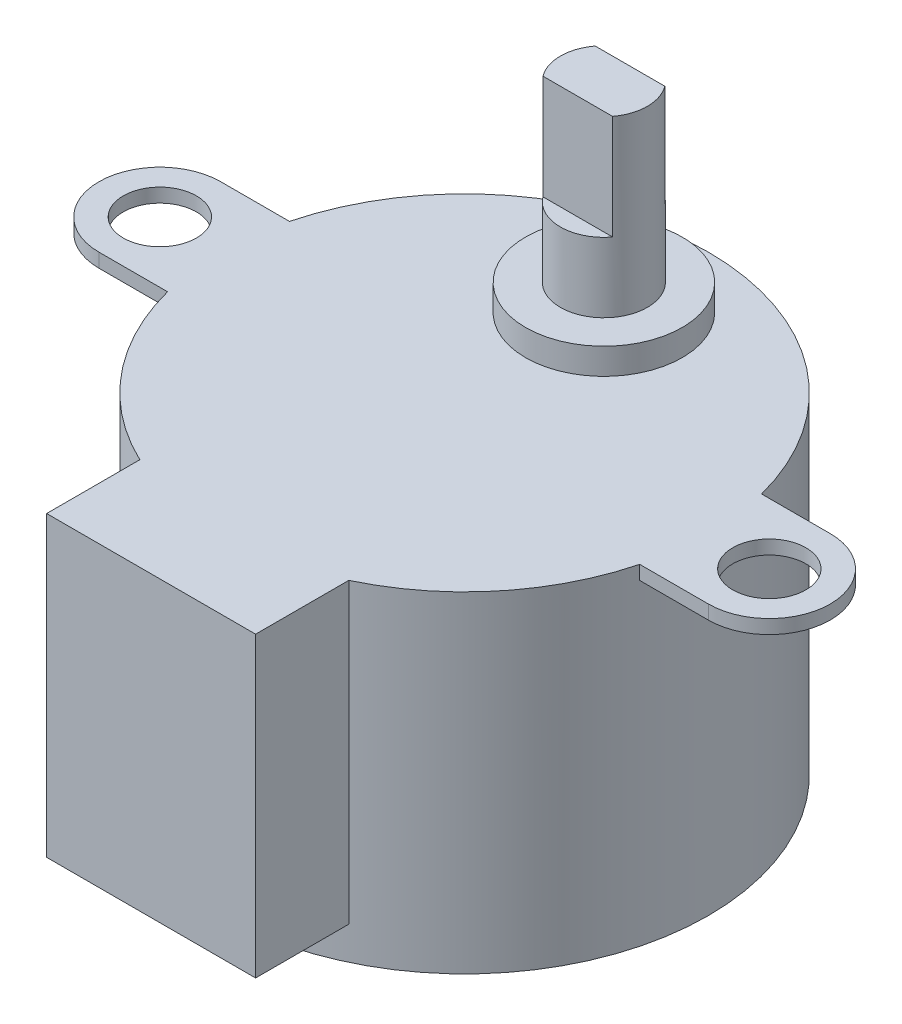
ISO-10303-21;
HEADER;
FILE_DESCRIPTION(('STEP AP214'),'2;1');
FILE_NAME('part.step','',(''),(''),'','','');
FILE_SCHEMA(('AUTOMOTIVE_DESIGN { 1 0 10303 214 1 1 1 1 }'));
ENDSEC;
DATA;
#1=APPLICATION_CONTEXT('core data for automotive mechanical design processes');
#2=APPLICATION_PROTOCOL_DEFINITION('international standard','automotive_design',2000,#1);
#3=PRODUCT_CONTEXT('',#1,'mechanical');
#4=PRODUCT('Part','Part','',(#3));
#5=PRODUCT_RELATED_PRODUCT_CATEGORY('part','',(#4));
#6=PRODUCT_DEFINITION_FORMATION('','',#4);
#7=PRODUCT_DEFINITION_CONTEXT('part definition',#1,'design');
#8=PRODUCT_DEFINITION('design','',#6,#7);
#9=PRODUCT_DEFINITION_SHAPE('','',#8);
#10=(LENGTH_UNIT() NAMED_UNIT(*) SI_UNIT(.MILLI.,.METRE.));
#11=(NAMED_UNIT(*) PLANE_ANGLE_UNIT() SI_UNIT($,.RADIAN.));
#12=(NAMED_UNIT(*) SI_UNIT($,.STERADIAN.) SOLID_ANGLE_UNIT());
#13=UNCERTAINTY_MEASURE_WITH_UNIT(LENGTH_MEASURE(1.E-05),#10,'distance_accuracy_value','');
#14=(GEOMETRIC_REPRESENTATION_CONTEXT(3) GLOBAL_UNCERTAINTY_ASSIGNED_CONTEXT((#13)) GLOBAL_UNIT_ASSIGNED_CONTEXT((#10,
#11,#12)) REPRESENTATION_CONTEXT('',''));
#15=CARTESIAN_POINT('',(0.,0.,0.));
#16=DIRECTION('',(0.,0.,1.));
#17=DIRECTION('',(1.,0.,0.));
#18=AXIS2_PLACEMENT_3D('',#15,#16,#17);
#19=CARTESIAN_POINT('',(0.,19.,0.));
#20=DIRECTION('',(0.,-1.,0.));
#21=DIRECTION('',(0.,0.,-1.));
#22=AXIS2_PLACEMENT_3D('',#19,#20,#21);
#23=CYLINDRICAL_SURFACE('',#22,14.);
#24=CARTESIAN_POINT('',(0.,1.9,0.));
#25=DIRECTION('',(0.,-1.,0.));
#26=DIRECTION('',(0.,0.,-1.));
#27=AXIS2_PLACEMENT_3D('',#24,#25,#26);
#28=CIRCLE('',#27,14.);
#29=CARTESIAN_POINT('',(-6.,1.9,12.6491106406735));
#30=VERTEX_POINT('',#29);
#31=CARTESIAN_POINT('',(6.,1.9,12.6491106406735));
#32=VERTEX_POINT('',#31);
#33=EDGE_CURVE('E199',#30,#32,#28,.F.);
#34=ORIENTED_EDGE('',*,*,#33,.F.);
#35=DIRECTION('',(0.,-1.,0.));
#36=VECTOR('',#35,1.);
#37=CARTESIAN_POINT('',(-6.,19.,12.6491106406735));
#38=LINE('',#37,#36);
#39=CARTESIAN_POINT('',(-6.,19.,12.6491106406735));
#40=VERTEX_POINT('',#39);
#41=EDGE_CURVE('E176',#40,#30,#38,.T.);
#42=ORIENTED_EDGE('',*,*,#41,.F.);
#43=CARTESIAN_POINT('',(0.,19.,0.));
#44=DIRECTION('',(0.,1.,0.));
#45=DIRECTION('',(0.,0.,1.));
#46=AXIS2_PLACEMENT_3D('',#43,#44,#45);
#47=CIRCLE('',#46,14.);
#48=CARTESIAN_POINT('',(-13.555441711726,19.,3.5));
#49=VERTEX_POINT('',#48);
#50=EDGE_CURVE('E272',#49,#40,#47,.T.);
#51=ORIENTED_EDGE('',*,*,#50,.F.);
#52=DIRECTION('',(0.,1.,0.));
#53=VECTOR('',#52,1.);
#54=CARTESIAN_POINT('',(-13.555441711726,18.2,3.5));
#55=LINE('',#54,#53);
#56=CARTESIAN_POINT('',(-13.555441711726,18.2,3.5));
#57=VERTEX_POINT('',#56);
#58=EDGE_CURVE('E268',#57,#49,#55,.T.);
#59=ORIENTED_EDGE('',*,*,#58,.F.);
#60=CARTESIAN_POINT('',(0.,18.2,0.));
#61=DIRECTION('',(0.,1.,0.));
#62=DIRECTION('',(0.,0.,1.));
#63=AXIS2_PLACEMENT_3D('',#60,#61,#62);
#64=CIRCLE('',#63,14.);
#65=CARTESIAN_POINT('',(-13.555441711726,18.2,-3.5));
#66=VERTEX_POINT('',#65);
#67=EDGE_CURVE('E279',#66,#57,#64,.T.);
#68=ORIENTED_EDGE('',*,*,#67,.F.);
#69=DIRECTION('',(0.,1.,0.));
#70=VECTOR('',#69,1.);
#71=CARTESIAN_POINT('',(-13.555441711726,18.2,-3.5));
#72=LINE('',#71,#70);
#73=CARTESIAN_POINT('',(-13.555441711726,19.,-3.5));
#74=VERTEX_POINT('',#73);
#75=EDGE_CURVE('E255',#66,#74,#72,.T.);
#76=ORIENTED_EDGE('',*,*,#75,.T.);
#77=CARTESIAN_POINT('',(13.555441711726,19.,-3.5));
#78=VERTEX_POINT('',#77);
#79=EDGE_CURVE('E275',#78,#74,#47,.T.);
#80=ORIENTED_EDGE('',*,*,#79,.F.);
#81=DIRECTION('',(0.,1.,0.));
#82=VECTOR('',#81,1.);
#83=CARTESIAN_POINT('',(13.555441711726,18.2,-3.5));
#84=LINE('',#83,#82);
#85=CARTESIAN_POINT('',(13.555441711726,18.2,-3.5));
#86=VERTEX_POINT('',#85);
#87=EDGE_CURVE('E258',#86,#78,#84,.T.);
#88=ORIENTED_EDGE('',*,*,#87,.F.);
#89=CARTESIAN_POINT('',(13.555441711726,18.2,3.5));
#90=VERTEX_POINT('',#89);
#91=EDGE_CURVE('E172',#90,#86,#64,.T.);
#92=ORIENTED_EDGE('',*,*,#91,.F.);
#93=DIRECTION('',(0.,1.,0.));
#94=VECTOR('',#93,1.);
#95=CARTESIAN_POINT('',(13.555441711726,18.2,3.5));
#96=LINE('',#95,#94);
#97=CARTESIAN_POINT('',(13.555441711726,19.,3.5));
#98=VERTEX_POINT('',#97);
#99=EDGE_CURVE('E265',#90,#98,#96,.T.);
#100=ORIENTED_EDGE('',*,*,#99,.T.);
#101=CARTESIAN_POINT('',(6.,19.,12.6491106406735));
#102=VERTEX_POINT('',#101);
#103=EDGE_CURVE('E276',#102,#98,#47,.T.);
#104=ORIENTED_EDGE('',*,*,#103,.F.);
#105=DIRECTION('',(0.,-1.,0.));
#106=VECTOR('',#105,1.);
#107=CARTESIAN_POINT('',(6.,19.,12.6491106406735));
#108=LINE('',#107,#106);
#109=EDGE_CURVE('E195',#32,#102,#108,.F.);
#110=ORIENTED_EDGE('',*,*,#109,.F.);
#111=EDGE_LOOP('',(#34,#42,#51,#59,#68,#76,#80,#88,#92,#100,#104,#110));
#112=FACE_BOUND('',#111,.T.);
#113=CARTESIAN_POINT('',(0.,0.,0.));
#114=DIRECTION('',(0.,1.,0.));
#115=DIRECTION('',(0.,0.,1.));
#116=AXIS2_PLACEMENT_3D('',#113,#114,#115);
#117=CIRCLE('',#116,14.);
#118=CARTESIAN_POINT('',(0.,0.,14.));
#119=VERTEX_POINT('',#118);
#120=EDGE_CURVE('E254',#119,#119,#117,.T.);
#121=ORIENTED_EDGE('',*,*,#120,.T.);
#122=EDGE_LOOP('',(#121));
#123=FACE_BOUND('',#122,.T.);
#124=ADVANCED_FACE('F32',(#112,#123),#23,.T.);
#125=CARTESIAN_POINT('',(0.,19.,0.));
#126=DIRECTION('',(0.,1.,0.));
#127=DIRECTION('',(0.,0.,1.));
#128=AXIS2_PLACEMENT_3D('',#125,#126,#127);
#129=PLANE('',#128);
#130=CARTESIAN_POINT('',(0.,19.,-8.));
#131=DIRECTION('',(0.,1.,0.));
#132=DIRECTION('',(0.,0.,1.));
#133=AXIS2_PLACEMENT_3D('',#130,#131,#132);
#134=CIRCLE('',#133,4.5);
#135=CARTESIAN_POINT('',(0.,19.,-3.5));
#136=VERTEX_POINT('',#135);
#137=EDGE_CURVE('E165',#136,#136,#134,.T.);
#138=ORIENTED_EDGE('',*,*,#137,.F.);
#139=EDGE_LOOP('',(#138));
#140=FACE_BOUND('',#139,.T.);
#141=ORIENTED_EDGE('',*,*,#50,.T.);
#142=DIRECTION('',(0.,0.,1.));
#143=VECTOR('',#142,1.);
#144=CARTESIAN_POINT('',(-6.,19.,-14.001));
#145=LINE('',#144,#143);
#146=CARTESIAN_POINT('',(-6.,19.,18.));
#147=VERTEX_POINT('',#146);
#148=EDGE_CURVE('E193',#40,#147,#145,.T.);
#149=ORIENTED_EDGE('',*,*,#148,.T.);
#150=DIRECTION('',(-1.,0.,0.));
#151=VECTOR('',#150,1.);
#152=CARTESIAN_POINT('',(-6.,19.,18.));
#153=LINE('',#152,#151);
#154=CARTESIAN_POINT('',(6.,19.,18.));
#155=VERTEX_POINT('',#154);
#156=EDGE_CURVE('E179',#155,#147,#153,.T.);
#157=ORIENTED_EDGE('',*,*,#156,.F.);
#158=DIRECTION('',(0.,0.,1.));
#159=VECTOR('',#158,1.);
#160=CARTESIAN_POINT('',(6.,19.,-14.001));
#161=LINE('',#160,#159);
#162=EDGE_CURVE('E197',#102,#155,#161,.T.);
#163=ORIENTED_EDGE('',*,*,#162,.F.);
#164=ORIENTED_EDGE('',*,*,#103,.T.);
#165=DIRECTION('',(1.,0.,0.));
#166=VECTOR('',#165,1.);
#167=CARTESIAN_POINT('',(17.5,19.,3.5));
#168=LINE('',#167,#166);
#169=CARTESIAN_POINT('',(17.5,19.,3.5));
#170=VERTEX_POINT('',#169);
#171=EDGE_CURVE('E242',#98,#170,#168,.T.);
#172=ORIENTED_EDGE('',*,*,#171,.T.);
#173=CARTESIAN_POINT('',(17.5,19.,0.));
#174=DIRECTION('',(0.,1.,0.));
#175=DIRECTION('',(0.,0.,1.));
#176=AXIS2_PLACEMENT_3D('',#173,#174,#175);
#177=CIRCLE('',#176,3.5);
#178=CARTESIAN_POINT('',(17.5,19.,-3.5));
#179=VERTEX_POINT('',#178);
#180=EDGE_CURVE('E245',#170,#179,#177,.T.);
#181=ORIENTED_EDGE('',*,*,#180,.T.);
#182=DIRECTION('',(-1.,0.,0.));
#183=VECTOR('',#182,1.);
#184=CARTESIAN_POINT('',(17.5,19.,-3.5));
#185=LINE('',#184,#183);
#186=EDGE_CURVE('E248',#179,#78,#185,.T.);
#187=ORIENTED_EDGE('',*,*,#186,.T.);
#188=ORIENTED_EDGE('',*,*,#79,.T.);
#189=DIRECTION('',(-1.,0.,0.));
#190=VECTOR('',#189,1.);
#191=CARTESIAN_POINT('',(-17.5,19.,-3.5));
#192=LINE('',#191,#190);
#193=CARTESIAN_POINT('',(-17.5,19.,-3.5));
#194=VERTEX_POINT('',#193);
#195=EDGE_CURVE('E222',#74,#194,#192,.T.);
#196=ORIENTED_EDGE('',*,*,#195,.T.);
#197=CARTESIAN_POINT('',(-17.5,19.,0.));
#198=DIRECTION('',(0.,1.,0.));
#199=DIRECTION('',(0.,0.,1.));
#200=AXIS2_PLACEMENT_3D('',#197,#198,#199);
#201=CIRCLE('',#200,3.5);
#202=CARTESIAN_POINT('',(-17.5,19.,3.5));
#203=VERTEX_POINT('',#202);
#204=EDGE_CURVE('E215',#194,#203,#201,.T.);
#205=ORIENTED_EDGE('',*,*,#204,.T.);
#206=DIRECTION('',(1.,0.,0.));
#207=VECTOR('',#206,1.);
#208=CARTESIAN_POINT('',(-17.5,19.,3.5));
#209=LINE('',#208,#207);
#210=EDGE_CURVE('E240',#203,#49,#209,.T.);
#211=ORIENTED_EDGE('',*,*,#210,.T.);
#212=EDGE_LOOP('',(#141,#149,#157,#163,#164,#172,#181,#187,#188,#196,#205,#211));
#213=FACE_BOUND('',#212,.T.);
#214=CARTESIAN_POINT('',(-17.5,19.,0.));
#215=DIRECTION('',(0.,1.,0.));
#216=DIRECTION('',(0.,0.,1.));
#217=AXIS2_PLACEMENT_3D('',#214,#215,#216);
#218=CIRCLE('',#217,2.1);
#219=CARTESIAN_POINT('',(-17.5,19.,2.1));
#220=VERTEX_POINT('',#219);
#221=EDGE_CURVE('E209',#220,#220,#218,.T.);
#222=ORIENTED_EDGE('',*,*,#221,.F.);
#223=EDGE_LOOP('',(#222));
#224=FACE_BOUND('',#223,.T.);
#225=CARTESIAN_POINT('',(17.5,19.,0.));
#226=DIRECTION('',(0.,1.,0.));
#227=DIRECTION('',(0.,0.,1.));
#228=AXIS2_PLACEMENT_3D('',#225,#226,#227);
#229=CIRCLE('',#228,2.1);
#230=CARTESIAN_POINT('',(17.5,19.,2.1));
#231=VERTEX_POINT('',#230);
#232=EDGE_CURVE('E182',#231,#231,#229,.T.);
#233=ORIENTED_EDGE('',*,*,#232,.F.);
#234=EDGE_LOOP('',(#233));
#235=FACE_BOUND('',#234,.T.);
#236=ADVANCED_FACE('F301',(#140,#213,#224,#235),#129,.T.);
#237=CARTESIAN_POINT('',(0.,0.,0.));
#238=DIRECTION('',(0.,1.,0.));
#239=DIRECTION('',(0.,0.,1.));
#240=AXIS2_PLACEMENT_3D('',#237,#238,#239);
#241=PLANE('',#240);
#242=ORIENTED_EDGE('',*,*,#120,.F.);
#243=EDGE_LOOP('',(#242));
#244=FACE_BOUND('',#243,.T.);
#245=ADVANCED_FACE('F306',(#244),#241,.F.);
#246=CARTESIAN_POINT('',(-17.5,18.2,0.));
#247=DIRECTION('',(0.,1.,0.));
#248=DIRECTION('',(0.,0.,1.));
#249=AXIS2_PLACEMENT_3D('',#246,#247,#248);
#250=CYLINDRICAL_SURFACE('',#249,3.5);
#251=ORIENTED_EDGE('',*,*,#204,.F.);
#252=DIRECTION('',(0.,1.,0.));
#253=VECTOR('',#252,1.);
#254=CARTESIAN_POINT('',(-17.5,18.2,-3.5));
#255=LINE('',#254,#253);
#256=CARTESIAN_POINT('',(-17.5,18.2,-3.5));
#257=VERTEX_POINT('',#256);
#258=EDGE_CURVE('E252',#257,#194,#255,.T.);
#259=ORIENTED_EDGE('',*,*,#258,.F.);
#260=CARTESIAN_POINT('',(-17.5,18.2,0.));
#261=DIRECTION('',(0.,1.,0.));
#262=DIRECTION('',(0.,0.,1.));
#263=AXIS2_PLACEMENT_3D('',#260,#261,#262);
#264=CIRCLE('',#263,3.5);
#265=CARTESIAN_POINT('',(-17.5,18.2,3.5));
#266=VERTEX_POINT('',#265);
#267=EDGE_CURVE('E218',#257,#266,#264,.T.);
#268=ORIENTED_EDGE('',*,*,#267,.T.);
#269=DIRECTION('',(0.,1.,0.));
#270=VECTOR('',#269,1.);
#271=CARTESIAN_POINT('',(-17.5,18.2,3.5));
#272=LINE('',#271,#270);
#273=EDGE_CURVE('E237',#266,#203,#272,.T.);
#274=ORIENTED_EDGE('',*,*,#273,.T.);
#275=EDGE_LOOP('',(#251,#259,#268,#274));
#276=FACE_BOUND('',#275,.T.);
#277=ADVANCED_FACE('F316',(#276),#250,.T.);
#278=CARTESIAN_POINT('',(-17.5,18.2,0.));
#279=DIRECTION('',(0.,1.,0.));
#280=DIRECTION('',(0.,0.,1.));
#281=AXIS2_PLACEMENT_3D('',#278,#279,#280);
#282=CYLINDRICAL_SURFACE('',#281,2.1);
#283=CARTESIAN_POINT('',(-17.5,18.2,0.));
#284=DIRECTION('',(0.,1.,0.));
#285=DIRECTION('',(0.,0.,1.));
#286=AXIS2_PLACEMENT_3D('',#283,#284,#285);
#287=CIRCLE('',#286,2.1);
#288=CARTESIAN_POINT('',(-17.5,18.2,2.1));
#289=VERTEX_POINT('',#288);
#290=EDGE_CURVE('E212',#289,#289,#287,.T.);
#291=ORIENTED_EDGE('',*,*,#290,.F.);
#292=EDGE_LOOP('',(#291));
#293=FACE_BOUND('',#292,.T.);
#294=ORIENTED_EDGE('',*,*,#221,.T.);
#295=EDGE_LOOP('',(#294));
#296=FACE_BOUND('',#295,.T.);
#297=ADVANCED_FACE('F320',(#293,#296),#282,.F.);
#298=CARTESIAN_POINT('',(-17.5,18.2,0.));
#299=DIRECTION('',(0.,1.,0.));
#300=DIRECTION('',(0.,0.,1.));
#301=AXIS2_PLACEMENT_3D('',#298,#299,#300);
#302=PLANE('',#301);
#303=ORIENTED_EDGE('',*,*,#290,.T.);
#304=EDGE_LOOP('',(#303));
#305=FACE_BOUND('',#304,.T.);
#306=DIRECTION('',(-1.,0.,0.));
#307=VECTOR('',#306,1.);
#308=CARTESIAN_POINT('',(-17.5,18.2,-3.5));
#309=LINE('',#308,#307);
#310=EDGE_CURVE('E234',#66,#257,#309,.T.);
#311=ORIENTED_EDGE('',*,*,#310,.F.);
#312=ORIENTED_EDGE('',*,*,#67,.T.);
#313=DIRECTION('',(1.,0.,0.));
#314=VECTOR('',#313,1.);
#315=CARTESIAN_POINT('',(-17.5,18.2,3.5));
#316=LINE('',#315,#314);
#317=EDGE_CURVE('E221',#266,#57,#316,.T.);
#318=ORIENTED_EDGE('',*,*,#317,.F.);
#319=ORIENTED_EDGE('',*,*,#267,.F.);
#320=EDGE_LOOP('',(#311,#312,#318,#319));
#321=FACE_BOUND('',#320,.T.);
#322=ADVANCED_FACE('F328',(#305,#321),#302,.F.);
#323=CARTESIAN_POINT('',(-17.5,18.2,3.5));
#324=DIRECTION('',(0.,0.,1.));
#325=DIRECTION('',(1.,0.,0.));
#326=AXIS2_PLACEMENT_3D('',#323,#324,#325);
#327=PLANE('',#326);
#328=ORIENTED_EDGE('',*,*,#210,.F.);
#329=ORIENTED_EDGE('',*,*,#273,.F.);
#330=ORIENTED_EDGE('',*,*,#317,.T.);
#331=ORIENTED_EDGE('',*,*,#58,.T.);
#332=EDGE_LOOP('',(#328,#329,#330,#331));
#333=FACE_BOUND('',#332,.T.);
#334=ADVANCED_FACE('F324',(#333),#327,.T.);
#335=CARTESIAN_POINT('',(-17.5,18.2,-3.5));
#336=DIRECTION('',(0.,0.,-1.));
#337=DIRECTION('',(-1.,0.,0.));
#338=AXIS2_PLACEMENT_3D('',#335,#336,#337);
#339=PLANE('',#338);
#340=ORIENTED_EDGE('',*,*,#195,.F.);
#341=ORIENTED_EDGE('',*,*,#75,.F.);
#342=ORIENTED_EDGE('',*,*,#310,.T.);
#343=ORIENTED_EDGE('',*,*,#258,.T.);
#344=EDGE_LOOP('',(#340,#341,#342,#343));
#345=FACE_BOUND('',#344,.T.);
#346=ADVANCED_FACE('F327',(#345),#339,.T.);
#347=CARTESIAN_POINT('',(17.5,18.2,0.));
#348=DIRECTION('',(0.,1.,0.));
#349=DIRECTION('',(0.,0.,1.));
#350=AXIS2_PLACEMENT_3D('',#347,#348,#349);
#351=CIRCLE('',#350,2.1);
#352=CARTESIAN_POINT('',(17.5,18.2,2.1));
#353=VERTEX_POINT('',#352);
#354=EDGE_CURVE('E206',#353,#353,#351,.T.);
#355=ORIENTED_EDGE('',*,*,#354,.T.);
#356=EDGE_LOOP('',(#355));
#357=FACE_BOUND('',#356,.T.);
#358=DIRECTION('',(1.,0.,0.));
#359=VECTOR('',#358,1.);
#360=CARTESIAN_POINT('',(17.5,18.2,3.5));
#361=LINE('',#360,#359);
#362=CARTESIAN_POINT('',(17.5,18.2,3.5));
#363=VERTEX_POINT('',#362);
#364=EDGE_CURVE('E225',#90,#363,#361,.T.);
#365=ORIENTED_EDGE('',*,*,#364,.F.);
#366=ORIENTED_EDGE('',*,*,#91,.T.);
#367=DIRECTION('',(-1.,0.,0.));
#368=VECTOR('',#367,1.);
#369=CARTESIAN_POINT('',(17.5,18.2,-3.5));
#370=LINE('',#369,#368);
#371=CARTESIAN_POINT('',(17.5,18.2,-3.5));
#372=VERTEX_POINT('',#371);
#373=EDGE_CURVE('E231',#372,#86,#370,.T.);
#374=ORIENTED_EDGE('',*,*,#373,.F.);
#375=CARTESIAN_POINT('',(17.5,18.2,0.));
#376=DIRECTION('',(0.,1.,0.));
#377=DIRECTION('',(0.,0.,1.));
#378=AXIS2_PLACEMENT_3D('',#375,#376,#377);
#379=CIRCLE('',#378,3.5);
#380=EDGE_CURVE('E228',#363,#372,#379,.T.);
#381=ORIENTED_EDGE('',*,*,#380,.F.);
#382=EDGE_LOOP('',(#365,#366,#374,#381));
#383=FACE_BOUND('',#382,.T.);
#384=ADVANCED_FACE('F342',(#357,#383),#302,.F.);
#385=CARTESIAN_POINT('',(17.5,18.2,-3.5));
#386=DIRECTION('',(0.,0.,-1.));
#387=DIRECTION('',(-1.,0.,0.));
#388=AXIS2_PLACEMENT_3D('',#385,#386,#387);
#389=PLANE('',#388);
#390=ORIENTED_EDGE('',*,*,#186,.F.);
#391=DIRECTION('',(0.,1.,0.));
#392=VECTOR('',#391,1.);
#393=CARTESIAN_POINT('',(17.5,18.2,-3.5));
#394=LINE('',#393,#392);
#395=EDGE_CURVE('E261',#372,#179,#394,.T.);
#396=ORIENTED_EDGE('',*,*,#395,.F.);
#397=ORIENTED_EDGE('',*,*,#373,.T.);
#398=ORIENTED_EDGE('',*,*,#87,.T.);
#399=EDGE_LOOP('',(#390,#396,#397,#398));
#400=FACE_BOUND('',#399,.T.);
#401=ADVANCED_FACE('F338',(#400),#389,.T.);
#402=CARTESIAN_POINT('',(17.5,18.2,0.));
#403=DIRECTION('',(0.,1.,0.));
#404=DIRECTION('',(0.,0.,1.));
#405=AXIS2_PLACEMENT_3D('',#402,#403,#404);
#406=CYLINDRICAL_SURFACE('',#405,3.5);
#407=ORIENTED_EDGE('',*,*,#180,.F.);
#408=DIRECTION('',(0.,1.,0.));
#409=VECTOR('',#408,1.);
#410=CARTESIAN_POINT('',(17.5,18.2,3.5));
#411=LINE('',#410,#409);
#412=EDGE_CURVE('E263',#363,#170,#411,.T.);
#413=ORIENTED_EDGE('',*,*,#412,.F.);
#414=ORIENTED_EDGE('',*,*,#380,.T.);
#415=ORIENTED_EDGE('',*,*,#395,.T.);
#416=EDGE_LOOP('',(#407,#413,#414,#415));
#417=FACE_BOUND('',#416,.T.);
#418=ADVANCED_FACE('F334',(#417),#406,.T.);
#419=CARTESIAN_POINT('',(17.5,18.2,3.5));
#420=DIRECTION('',(0.,0.,1.));
#421=DIRECTION('',(1.,0.,0.));
#422=AXIS2_PLACEMENT_3D('',#419,#420,#421);
#423=PLANE('',#422);
#424=ORIENTED_EDGE('',*,*,#171,.F.);
#425=ORIENTED_EDGE('',*,*,#99,.F.);
#426=ORIENTED_EDGE('',*,*,#364,.T.);
#427=ORIENTED_EDGE('',*,*,#412,.T.);
#428=EDGE_LOOP('',(#424,#425,#426,#427));
#429=FACE_BOUND('',#428,.T.);
#430=ADVANCED_FACE('F330',(#429),#423,.T.);
#431=CARTESIAN_POINT('',(17.5,18.2,0.));
#432=DIRECTION('',(0.,1.,0.));
#433=DIRECTION('',(0.,0.,1.));
#434=AXIS2_PLACEMENT_3D('',#431,#432,#433);
#435=CYLINDRICAL_SURFACE('',#434,2.1);
#436=ORIENTED_EDGE('',*,*,#354,.F.);
#437=EDGE_LOOP('',(#436));
#438=FACE_BOUND('',#437,.T.);
#439=ORIENTED_EDGE('',*,*,#232,.T.);
#440=EDGE_LOOP('',(#439));
#441=FACE_BOUND('',#440,.T.);
#442=ADVANCED_FACE('F333',(#438,#441),#435,.F.);
#443=CARTESIAN_POINT('',(-6.,19.,-14.001));
#444=DIRECTION('',(-1.,0.,0.));
#445=DIRECTION('',(0.,-1.,0.));
#446=AXIS2_PLACEMENT_3D('',#443,#444,#445);
#447=PLANE('',#446);
#448=ORIENTED_EDGE('',*,*,#148,.F.);
#449=ORIENTED_EDGE('',*,*,#41,.T.);
#450=DIRECTION('',(0.,0.,1.));
#451=VECTOR('',#450,1.);
#452=CARTESIAN_POINT('',(-6.,1.9,-14.001));
#453=LINE('',#452,#451);
#454=CARTESIAN_POINT('',(-6.,1.9,18.));
#455=VERTEX_POINT('',#454);
#456=EDGE_CURVE('E196',#30,#455,#453,.T.);
#457=ORIENTED_EDGE('',*,*,#456,.T.);
#458=DIRECTION('',(0.,-1.,0.));
#459=VECTOR('',#458,1.);
#460=CARTESIAN_POINT('',(-6.,19.,18.));
#461=LINE('',#460,#459);
#462=EDGE_CURVE('E189',#147,#455,#461,.T.);
#463=ORIENTED_EDGE('',*,*,#462,.F.);
#464=EDGE_LOOP('',(#448,#449,#457,#463));
#465=FACE_BOUND('',#464,.T.);
#466=ADVANCED_FACE('F355',(#465),#447,.T.);
#467=CARTESIAN_POINT('',(6.,19.,-14.001));
#468=DIRECTION('',(1.,0.,0.));
#469=DIRECTION('',(0.,1.,0.));
#470=AXIS2_PLACEMENT_3D('',#467,#468,#469);
#471=PLANE('',#470);
#472=DIRECTION('',(0.,0.,1.));
#473=VECTOR('',#472,1.);
#474=CARTESIAN_POINT('',(6.,1.9,-14.001));
#475=LINE('',#474,#473);
#476=CARTESIAN_POINT('',(6.,1.9,18.));
#477=VERTEX_POINT('',#476);
#478=EDGE_CURVE('E192',#32,#477,#475,.T.);
#479=ORIENTED_EDGE('',*,*,#478,.F.);
#480=ORIENTED_EDGE('',*,*,#109,.T.);
#481=ORIENTED_EDGE('',*,*,#162,.T.);
#482=DIRECTION('',(0.,1.,0.));
#483=VECTOR('',#482,1.);
#484=CARTESIAN_POINT('',(6.,19.,18.));
#485=LINE('',#484,#483);
#486=EDGE_CURVE('E183',#477,#155,#485,.T.);
#487=ORIENTED_EDGE('',*,*,#486,.F.);
#488=EDGE_LOOP('',(#479,#480,#481,#487));
#489=FACE_BOUND('',#488,.T.);
#490=ADVANCED_FACE('F361',(#489),#471,.T.);
#491=CARTESIAN_POINT('',(-6.,1.9,-14.001));
#492=DIRECTION('',(0.,-1.,0.));
#493=DIRECTION('',(0.,0.,-1.));
#494=AXIS2_PLACEMENT_3D('',#491,#492,#493);
#495=PLANE('',#494);
#496=ORIENTED_EDGE('',*,*,#456,.F.);
#497=ORIENTED_EDGE('',*,*,#33,.T.);
#498=ORIENTED_EDGE('',*,*,#478,.T.);
#499=DIRECTION('',(1.,0.,0.));
#500=VECTOR('',#499,1.);
#501=CARTESIAN_POINT('',(-6.,1.9,18.));
#502=LINE('',#501,#500);
#503=EDGE_CURVE('E186',#455,#477,#502,.T.);
#504=ORIENTED_EDGE('',*,*,#503,.F.);
#505=EDGE_LOOP('',(#496,#497,#498,#504));
#506=FACE_BOUND('',#505,.T.);
#507=ADVANCED_FACE('F357',(#506),#495,.T.);
#508=CARTESIAN_POINT('',(0.,0.,18.));
#509=DIRECTION('',(0.,0.,1.));
#510=DIRECTION('',(1.,0.,0.));
#511=AXIS2_PLACEMENT_3D('',#508,#509,#510);
#512=PLANE('',#511);
#513=ORIENTED_EDGE('',*,*,#462,.T.);
#514=ORIENTED_EDGE('',*,*,#503,.T.);
#515=ORIENTED_EDGE('',*,*,#486,.T.);
#516=ORIENTED_EDGE('',*,*,#156,.T.);
#517=EDGE_LOOP('',(#513,#514,#515,#516));
#518=FACE_BOUND('',#517,.T.);
#519=ADVANCED_FACE('F360',(#518),#512,.T.);
#520=CARTESIAN_POINT('',(0.,20.5,-8.));
#521=DIRECTION('',(0.,-1.,0.));
#522=DIRECTION('',(0.,0.,-1.));
#523=AXIS2_PLACEMENT_3D('',#520,#521,#522);
#524=CYLINDRICAL_SURFACE('',#523,4.5);
#525=CARTESIAN_POINT('',(0.,20.5,-8.));
#526=DIRECTION('',(0.,1.,0.));
#527=DIRECTION('',(0.,0.,1.));
#528=AXIS2_PLACEMENT_3D('',#525,#526,#527);
#529=CIRCLE('',#528,4.5);
#530=CARTESIAN_POINT('',(0.,20.5,-3.5));
#531=VERTEX_POINT('',#530);
#532=EDGE_CURVE('E173',#531,#531,#529,.T.);
#533=ORIENTED_EDGE('',*,*,#532,.F.);
#534=EDGE_LOOP('',(#533));
#535=FACE_BOUND('',#534,.T.);
#536=ORIENTED_EDGE('',*,*,#137,.T.);
#537=EDGE_LOOP('',(#536));
#538=FACE_BOUND('',#537,.T.);
#539=ADVANCED_FACE('F371',(#535,#538),#524,.T.);
#540=CARTESIAN_POINT('',(0.,20.5,-8.));
#541=DIRECTION('',(0.,1.,0.));
#542=DIRECTION('',(0.,0.,1.));
#543=AXIS2_PLACEMENT_3D('',#540,#541,#542);
#544=PLANE('',#543);
#545=CARTESIAN_POINT('',(0.,20.5,-8.));
#546=DIRECTION('',(0.,1.,0.));
#547=DIRECTION('',(0.,0.,1.));
#548=AXIS2_PLACEMENT_3D('',#545,#546,#547);
#549=CIRCLE('',#548,2.5);
#550=CARTESIAN_POINT('',(0.,20.5,-5.5));
#551=VERTEX_POINT('',#550);
#552=EDGE_CURVE('E152',#551,#551,#549,.T.);
#553=ORIENTED_EDGE('',*,*,#552,.F.);
#554=EDGE_LOOP('',(#553));
#555=FACE_BOUND('',#554,.T.);
#556=ORIENTED_EDGE('',*,*,#532,.T.);
#557=EDGE_LOOP('',(#556));
#558=FACE_BOUND('',#557,.T.);
#559=ADVANCED_FACE('F375',(#555,#558),#544,.T.);
#560=CARTESIAN_POINT('',(0.,30.5,-8.));
#561=DIRECTION('',(0.,-1.,0.));
#562=DIRECTION('',(0.,0.,-1.));
#563=AXIS2_PLACEMENT_3D('',#560,#561,#562);
#564=CYLINDRICAL_SURFACE('',#563,2.5);
#565=CARTESIAN_POINT('',(0.,30.5,-8.));
#566=DIRECTION('',(0.,1.,0.));
#567=DIRECTION('',(0.,0.,1.));
#568=AXIS2_PLACEMENT_3D('',#565,#566,#567);
#569=CIRCLE('',#568,2.5);
#570=CARTESIAN_POINT('',(-2.,30.5,-9.5));
#571=VERTEX_POINT('',#570);
#572=CARTESIAN_POINT('',(-2.,30.5,-6.5));
#573=VERTEX_POINT('',#572);
#574=EDGE_CURVE('E159',#571,#573,#569,.T.);
#575=ORIENTED_EDGE('',*,*,#574,.F.);
#576=DIRECTION('',(0.,-1.,0.));
#577=VECTOR('',#576,1.);
#578=CARTESIAN_POINT('',(-2.,30.5,-9.5));
#579=LINE('',#578,#577);
#580=CARTESIAN_POINT('',(-2.,24.5,-9.5));
#581=VERTEX_POINT('',#580);
#582=EDGE_CURVE('E46',#571,#581,#579,.T.);
#583=ORIENTED_EDGE('',*,*,#582,.T.);
#584=CARTESIAN_POINT('',(0.,24.5,-8.));
#585=DIRECTION('',(0.,1.,0.));
#586=DIRECTION('',(0.,0.,1.));
#587=AXIS2_PLACEMENT_3D('',#584,#585,#586);
#588=CIRCLE('',#587,2.5);
#589=CARTESIAN_POINT('',(2.,24.5,-9.5));
#590=VERTEX_POINT('',#589);
#591=EDGE_CURVE('E11',#590,#581,#588,.T.);
#592=ORIENTED_EDGE('',*,*,#591,.F.);
#593=DIRECTION('',(0.,-1.,0.));
#594=VECTOR('',#593,1.);
#595=CARTESIAN_POINT('',(2.,30.5,-9.5));
#596=LINE('',#595,#594);
#597=CARTESIAN_POINT('',(2.,30.5,-9.5));
#598=VERTEX_POINT('',#597);
#599=EDGE_CURVE('E166',#590,#598,#596,.F.);
#600=ORIENTED_EDGE('',*,*,#599,.T.);
#601=CARTESIAN_POINT('',(2.,30.5,-6.5));
#602=VERTEX_POINT('',#601);
#603=EDGE_CURVE('E163',#602,#598,#569,.T.);
#604=ORIENTED_EDGE('',*,*,#603,.F.);
#605=DIRECTION('',(0.,-1.,0.));
#606=VECTOR('',#605,1.);
#607=CARTESIAN_POINT('',(2.,30.5,-6.5));
#608=LINE('',#607,#606);
#609=CARTESIAN_POINT('',(2.,24.5,-6.5));
#610=VERTEX_POINT('',#609);
#611=EDGE_CURVE('E54',#602,#610,#608,.T.);
#612=ORIENTED_EDGE('',*,*,#611,.T.);
#613=CARTESIAN_POINT('',(0.,24.5,-8.));
#614=DIRECTION('',(0.,1.,0.));
#615=DIRECTION('',(0.,0.,1.));
#616=AXIS2_PLACEMENT_3D('',#613,#614,#615);
#617=CIRCLE('',#616,2.5);
#618=CARTESIAN_POINT('',(-2.,24.5,-6.5));
#619=VERTEX_POINT('',#618);
#620=EDGE_CURVE('E39',#619,#610,#617,.T.);
#621=ORIENTED_EDGE('',*,*,#620,.F.);
#622=DIRECTION('',(0.,-1.,0.));
#623=VECTOR('',#622,1.);
#624=CARTESIAN_POINT('',(-2.,30.5,-6.5));
#625=LINE('',#624,#623);
#626=EDGE_CURVE('E145',#619,#573,#625,.F.);
#627=ORIENTED_EDGE('',*,*,#626,.T.);
#628=EDGE_LOOP('',(#575,#583,#592,#600,#604,#612,#621,#627));
#629=FACE_BOUND('',#628,.T.);
#630=ORIENTED_EDGE('',*,*,#552,.T.);
#631=EDGE_LOOP('',(#630));
#632=FACE_BOUND('',#631,.T.);
#633=ADVANCED_FACE('F157',(#629,#632),#564,.T.);
#634=CARTESIAN_POINT('',(0.,30.5,-8.));
#635=DIRECTION('',(0.,1.,0.));
#636=DIRECTION('',(0.,0.,1.));
#637=AXIS2_PLACEMENT_3D('',#634,#635,#636);
#638=PLANE('',#637);
#639=DIRECTION('',(1.,0.,0.));
#640=VECTOR('',#639,1.);
#641=CARTESIAN_POINT('',(0.,30.5,-9.5));
#642=LINE('',#641,#640);
#643=EDGE_CURVE('E151',#571,#598,#642,.T.);
#644=ORIENTED_EDGE('',*,*,#643,.F.);
#645=ORIENTED_EDGE('',*,*,#574,.T.);
#646=DIRECTION('',(-1.,0.,0.));
#647=VECTOR('',#646,1.);
#648=CARTESIAN_POINT('',(0.,30.5,-6.5));
#649=LINE('',#648,#647);
#650=EDGE_CURVE('E142',#602,#573,#649,.T.);
#651=ORIENTED_EDGE('',*,*,#650,.F.);
#652=ORIENTED_EDGE('',*,*,#603,.T.);
#653=EDGE_LOOP('',(#644,#645,#651,#652));
#654=FACE_BOUND('',#653,.T.);
#655=ADVANCED_FACE('F162',(#654),#638,.T.);
#656=CARTESIAN_POINT('',(0.,24.5,0.));
#657=DIRECTION('',(0.,1.,0.));
#658=DIRECTION('',(0.,0.,1.));
#659=AXIS2_PLACEMENT_3D('',#656,#657,#658);
#660=PLANE('',#659);
#661=ORIENTED_EDGE('',*,*,#620,.T.);
#662=DIRECTION('',(-1.,0.,0.));
#663=VECTOR('',#662,1.);
#664=CARTESIAN_POINT('',(3.16015555113416,24.5,-6.5));
#665=LINE('',#664,#663);
#666=EDGE_CURVE('E283',#610,#619,#665,.T.);
#667=ORIENTED_EDGE('',*,*,#666,.T.);
#668=EDGE_LOOP('',(#661,#667));
#669=FACE_BOUND('',#668,.T.);
#670=ADVANCED_FACE('F282',(#669),#660,.T.);
#671=CARTESIAN_POINT('',(3.16015555113416,24.5,-6.5));
#672=DIRECTION('',(0.,0.,-1.));
#673=DIRECTION('',(-1.,0.,0.));
#674=AXIS2_PLACEMENT_3D('',#671,#672,#673);
#675=PLANE('',#674);
#676=ORIENTED_EDGE('',*,*,#650,.T.);
#677=ORIENTED_EDGE('',*,*,#626,.F.);
#678=ORIENTED_EDGE('',*,*,#666,.F.);
#679=ORIENTED_EDGE('',*,*,#611,.F.);
#680=EDGE_LOOP('',(#676,#677,#678,#679));
#681=FACE_BOUND('',#680,.T.);
#682=ADVANCED_FACE('F144',(#681),#675,.F.);
#683=CARTESIAN_POINT('',(0.,24.5,0.));
#684=DIRECTION('',(0.,1.,0.));
#685=DIRECTION('',(0.,0.,1.));
#686=AXIS2_PLACEMENT_3D('',#683,#684,#685);
#687=PLANE('',#686);
#688=ORIENTED_EDGE('',*,*,#591,.T.);
#689=DIRECTION('',(1.,0.,0.));
#690=VECTOR('',#689,1.);
#691=CARTESIAN_POINT('',(3.31506873983138,24.5,-9.5));
#692=LINE('',#691,#690);
#693=EDGE_CURVE('E160',#581,#590,#692,.T.);
#694=ORIENTED_EDGE('',*,*,#693,.T.);
#695=EDGE_LOOP('',(#688,#694));
#696=FACE_BOUND('',#695,.T.);
#697=ADVANCED_FACE('F291',(#696),#687,.T.);
#698=CARTESIAN_POINT('',(3.31506873983138,24.5,-9.5));
#699=DIRECTION('',(0.,0.,1.));
#700=DIRECTION('',(1.,0.,0.));
#701=AXIS2_PLACEMENT_3D('',#698,#699,#700);
#702=PLANE('',#701);
#703=ORIENTED_EDGE('',*,*,#643,.T.);
#704=ORIENTED_EDGE('',*,*,#599,.F.);
#705=ORIENTED_EDGE('',*,*,#693,.F.);
#706=ORIENTED_EDGE('',*,*,#582,.F.);
#707=EDGE_LOOP('',(#703,#704,#705,#706));
#708=FACE_BOUND('',#707,.T.);
#709=ADVANCED_FACE('F292',(#708),#702,.F.);
#710=CLOSED_SHELL('',(#124,#236,#245,#277,#297,#322,#334,#346,#384,#401,#418,#430,#442,#466,
#490,#507,#519,#539,#559,#633,#655,#670,#682,#697,#709));
#711=MANIFOLD_SOLID_BREP('B2',#710);
#712=ADVANCED_BREP_SHAPE_REPRESENTATION('',(#18,#711),#14);
#713=SHAPE_DEFINITION_REPRESENTATION(#9,#712);
ENDSEC;
END-ISO-10303-21;
